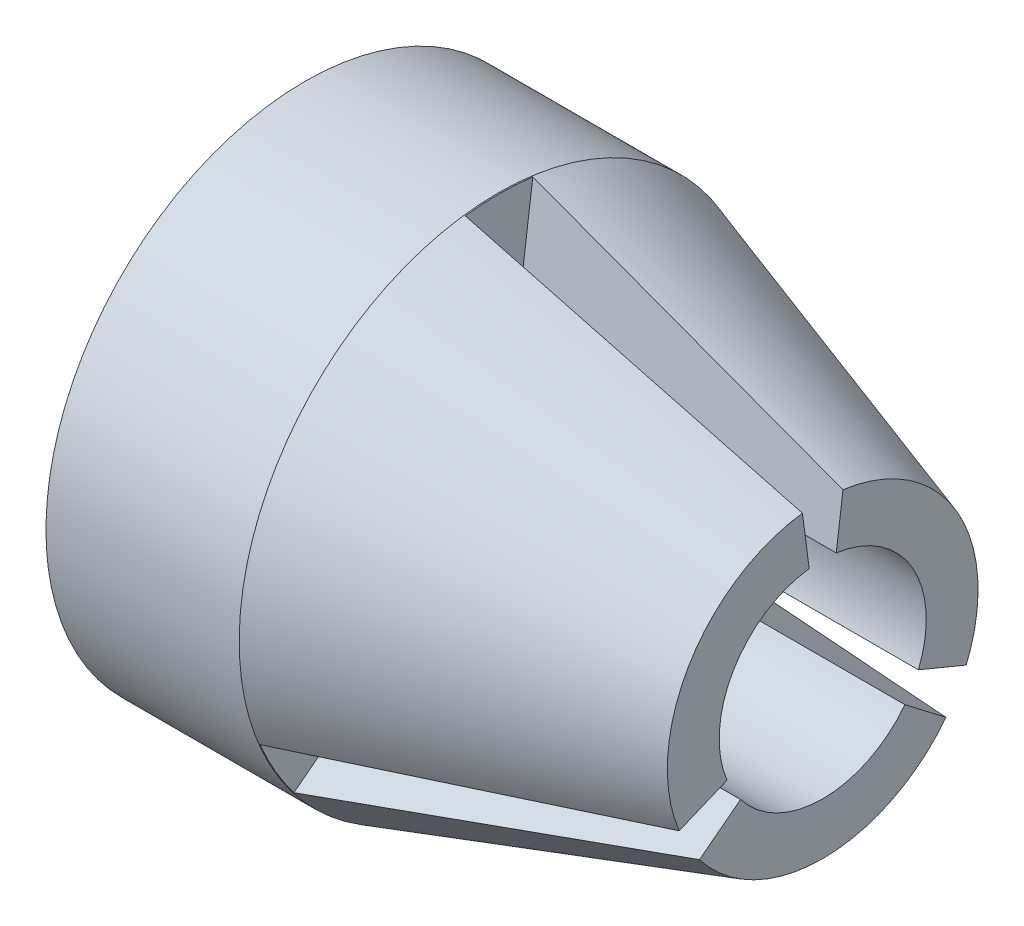
ISO-10303-21;
HEADER;
FILE_DESCRIPTION(('STEP AP214'),'2;1');
FILE_NAME('part.step','',(''),(''),'','','');
FILE_SCHEMA(('AUTOMOTIVE_DESIGN { 1 0 10303 214 1 1 1 1 }'));
ENDSEC;
DATA;
#1=APPLICATION_CONTEXT('core data for automotive mechanical design processes');
#2=APPLICATION_PROTOCOL_DEFINITION('international standard','automotive_design',2000,#1);
#3=PRODUCT_CONTEXT('',#1,'mechanical');
#4=PRODUCT('Part','Part','',(#3));
#5=PRODUCT_RELATED_PRODUCT_CATEGORY('part','',(#4));
#6=PRODUCT_DEFINITION_FORMATION('','',#4);
#7=PRODUCT_DEFINITION_CONTEXT('part definition',#1,'design');
#8=PRODUCT_DEFINITION('design','',#6,#7);
#9=PRODUCT_DEFINITION_SHAPE('','',#8);
#10=(LENGTH_UNIT() NAMED_UNIT(*) SI_UNIT(.MILLI.,.METRE.));
#11=(NAMED_UNIT(*) PLANE_ANGLE_UNIT() SI_UNIT($,.RADIAN.));
#12=(NAMED_UNIT(*) SI_UNIT($,.STERADIAN.) SOLID_ANGLE_UNIT());
#13=UNCERTAINTY_MEASURE_WITH_UNIT(LENGTH_MEASURE(1.E-05),#10,'distance_accuracy_value','');
#14=(GEOMETRIC_REPRESENTATION_CONTEXT(3) GLOBAL_UNCERTAINTY_ASSIGNED_CONTEXT((#13)) GLOBAL_UNIT_ASSIGNED_CONTEXT((#10,
#11,#12)) REPRESENTATION_CONTEXT('',''));
#15=CARTESIAN_POINT('',(0.,0.,0.));
#16=DIRECTION('',(0.,0.,1.));
#17=DIRECTION('',(1.,0.,0.));
#18=AXIS2_PLACEMENT_3D('',#15,#16,#17);
#19=CARTESIAN_POINT('',(10.,0.,0.));
#20=DIRECTION('',(-1.,0.,0.));
#21=DIRECTION('',(0.,-1.,0.));
#22=AXIS2_PLACEMENT_3D('',#19,#20,#21);
#23=CONICAL_SURFACE('',#22,3.,0.308847797397002);
#24=CARTESIAN_POINT('',(3.7315382726071,0.,0.));
#25=DIRECTION('',(1.,0.,0.));
#26=DIRECTION('',(0.,1.,0.));
#27=AXIS2_PLACEMENT_3D('',#24,#25,#26);
#28=CIRCLE('',#27,5.);
#29=CARTESIAN_POINT('',(3.7315382726071,5.,0.));
#30=VERTEX_POINT('',#29);
#31=EDGE_CURVE('E381',#30,#30,#28,.T.);
#32=ORIENTED_EDGE('',*,*,#31,.T.);
#33=EDGE_LOOP('',(#32));
#34=FACE_BOUND('',#33,.T.);
#35=CARTESIAN_POINT('',(10.,0.,0.));
#36=DIRECTION('',(1.,0.,0.));
#37=DIRECTION('',(0.,1.,0.));
#38=AXIS2_PLACEMENT_3D('',#35,#36,#37);
#39=CIRCLE('',#38,3.);
#40=CARTESIAN_POINT('',(10.,2.97433458412143,0.391578576660156));
#41=VERTEX_POINT('',#40);
#42=CARTESIAN_POINT('',(10.,-1.14805029709524,2.77163859753387));
#43=VERTEX_POINT('',#42);
#44=EDGE_CURVE('E262',#41,#43,#39,.T.);
#45=ORIENTED_EDGE('',*,*,#44,.F.);
#46=DIRECTION('',(0.952684427017851,-0.301360723173959,-0.0396748918805956));
#47=VECTOR('',#46,1.);
#48=CARTESIAN_POINT('',(19.4026925910893,0.,0.));
#49=LINE('',#48,#47);
#50=CARTESIAN_POINT('',(3.75,4.9513843462689,0.651862115701439));
#51=VERTEX_POINT('',#50);
#52=EDGE_CURVE('E427',#41,#51,#49,.F.);
#53=ORIENTED_EDGE('',*,*,#52,.T.);
#54=CARTESIAN_POINT('',(3.75,0.,0.));
#55=DIRECTION('',(1.,0.,0.));
#56=DIRECTION('',(0.,1.,0.));
#57=AXIS2_PLACEMENT_3D('',#54,#55,#56);
#58=CIRCLE('',#57,4.99410964661004);
#59=CARTESIAN_POINT('',(3.75,4.9513843462689,-0.651862115701437));
#60=VERTEX_POINT('',#59);
#61=EDGE_CURVE('E420',#51,#60,#58,.F.);
#62=ORIENTED_EDGE('',*,*,#61,.T.);
#63=DIRECTION('',(0.952684427017851,-0.301360723173959,0.0396748918805955));
#64=VECTOR('',#63,1.);
#65=CARTESIAN_POINT('',(19.4026925910893,0.,0.));
#66=LINE('',#65,#64);
#67=CARTESIAN_POINT('',(10.,2.97433458412143,-0.391578576660156));
#68=VERTEX_POINT('',#67);
#69=EDGE_CURVE('E448',#68,#60,#66,.F.);
#70=ORIENTED_EDGE('',*,*,#69,.F.);
#71=CARTESIAN_POINT('',(10.,-1.14805029709528,-2.77163859753386));
#72=VERTEX_POINT('',#71);
#73=EDGE_CURVE('E207',#72,#68,#39,.T.);
#74=ORIENTED_EDGE('',*,*,#73,.F.);
#75=DIRECTION('',(0.952684427017852,0.116320897325984,0.280823487911795));
#76=VECTOR('',#75,1.);
#77=CARTESIAN_POINT('',(19.4026925910893,0.,0.));
#78=LINE('',#77,#76);
#79=CARTESIAN_POINT('',(3.75,-1.91116302117235,-4.61395568562018));
#80=VERTEX_POINT('',#79);
#81=EDGE_CURVE('E253',#72,#80,#78,.F.);
#82=ORIENTED_EDGE('',*,*,#81,.T.);
#83=CARTESIAN_POINT('',(3.75,0.,0.));
#84=DIRECTION('',(1.,0.,0.));
#85=DIRECTION('',(0.,1.,0.));
#86=AXIS2_PLACEMENT_3D('',#83,#84,#85);
#87=CIRCLE('',#86,4.99410964661004);
#88=CARTESIAN_POINT('',(3.75,-3.04022132509658,-3.96209356991874));
#89=VERTEX_POINT('',#88);
#90=EDGE_CURVE('E315',#80,#89,#87,.F.);
#91=ORIENTED_EDGE('',*,*,#90,.T.);
#92=DIRECTION('',(0.952684427017852,0.185039825847977,0.241148596031199));
#93=VECTOR('',#92,1.);
#94=CARTESIAN_POINT('',(19.4026925910893,0.,0.));
#95=LINE('',#94,#93);
#96=CARTESIAN_POINT('',(10.,-1.82628428702618,-2.3800600208737));
#97=VERTEX_POINT('',#96);
#98=EDGE_CURVE('E331',#97,#89,#95,.F.);
#99=ORIENTED_EDGE('',*,*,#98,.F.);
#100=CARTESIAN_POINT('',(10.,-1.82628428702614,2.38006002087372));
#101=VERTEX_POINT('',#100);
#102=EDGE_CURVE('E259',#101,#97,#39,.T.);
#103=ORIENTED_EDGE('',*,*,#102,.F.);
#104=DIRECTION('',(0.952684427017851,0.185039825847974,-0.241148596031202));
#105=VECTOR('',#104,1.);
#106=CARTESIAN_POINT('',(19.4026925910893,0.,0.));
#107=LINE('',#106,#105);
#108=CARTESIAN_POINT('',(3.75,-3.04022132509653,3.96209356991878));
#109=VERTEX_POINT('',#108);
#110=EDGE_CURVE('E301',#101,#109,#107,.F.);
#111=ORIENTED_EDGE('',*,*,#110,.T.);
#112=CARTESIAN_POINT('',(3.75,0.,0.));
#113=DIRECTION('',(-1.,0.,0.));
#114=DIRECTION('',(0.,-1.,0.));
#115=AXIS2_PLACEMENT_3D('',#112,#113,#114);
#116=CIRCLE('',#115,4.99410964661004);
#117=CARTESIAN_POINT('',(3.75,-1.91116302117229,4.61395568562021));
#118=VERTEX_POINT('',#117);
#119=EDGE_CURVE('E284',#118,#109,#116,.F.);
#120=ORIENTED_EDGE('',*,*,#119,.F.);
#121=DIRECTION('',(0.952684427017852,0.11632089732598,-0.280823487911797));
#122=VECTOR('',#121,1.);
#123=CARTESIAN_POINT('',(19.4026925910893,0.,0.));
#124=LINE('',#123,#122);
#125=EDGE_CURVE('E289',#43,#118,#124,.F.);
#126=ORIENTED_EDGE('',*,*,#125,.F.);
#127=EDGE_LOOP('',(#45,#53,#62,#70,#74,#82,#91,#99,#103,#111,#120,#126));
#128=FACE_BOUND('',#127,.T.);
#129=ADVANCED_FACE('F63',(#34,#128),#23,.T.);
#130=CARTESIAN_POINT('',(5.,0.,0.));
#131=DIRECTION('',(-1.,0.,0.));
#132=DIRECTION('',(0.,-1.,0.));
#133=AXIS2_PLACEMENT_3D('',#130,#131,#132);
#134=CYLINDRICAL_SURFACE('',#133,1.);
#135=CARTESIAN_POINT('',(0.,0.,0.));
#136=DIRECTION('',(-1.,0.,0.));
#137=DIRECTION('',(0.,-1.,0.));
#138=AXIS2_PLACEMENT_3D('',#135,#136,#137);
#139=CIRCLE('',#138,1.);
#140=CARTESIAN_POINT('',(0.,-1.,0.));
#141=VERTEX_POINT('',#140);
#142=EDGE_CURVE('E246',#141,#141,#139,.T.);
#143=ORIENTED_EDGE('',*,*,#142,.T.);
#144=EDGE_LOOP('',(#143));
#145=FACE_BOUND('',#144,.T.);
#146=DIRECTION('',(-1.,0.,0.));
#147=VECTOR('',#146,1.);
#148=CARTESIAN_POINT('',(5.,0.99144486137381,0.130526192220052));
#149=LINE('',#148,#147);
#150=CARTESIAN_POINT('',(5.,0.99144486137381,0.130526192220052));
#151=VERTEX_POINT('',#150);
#152=CARTESIAN_POINT('',(3.75,0.99144486137381,0.130526192220052));
#153=VERTEX_POINT('',#152);
#154=EDGE_CURVE('E442',#151,#153,#149,.T.);
#155=ORIENTED_EDGE('',*,*,#154,.F.);
#156=CARTESIAN_POINT('',(5.,0.,0.));
#157=DIRECTION('',(-1.,0.,0.));
#158=DIRECTION('',(0.,-1.,0.));
#159=AXIS2_PLACEMENT_3D('',#156,#157,#158);
#160=CIRCLE('',#159,1.);
#161=CARTESIAN_POINT('',(5.,-0.382683432365082,0.92387953251129));
#162=VERTEX_POINT('',#161);
#163=EDGE_CURVE('E234',#162,#151,#160,.T.);
#164=ORIENTED_EDGE('',*,*,#163,.F.);
#165=DIRECTION('',(-1.,0.,0.));
#166=VECTOR('',#165,1.);
#167=CARTESIAN_POINT('',(5.,-0.382683432365082,0.92387953251129));
#168=LINE('',#167,#166);
#169=CARTESIAN_POINT('',(3.75,-0.382683432365082,0.92387953251129));
#170=VERTEX_POINT('',#169);
#171=EDGE_CURVE('E282',#162,#170,#168,.T.);
#172=ORIENTED_EDGE('',*,*,#171,.T.);
#173=CARTESIAN_POINT('',(3.75,0.,0.));
#174=DIRECTION('',(-1.,0.,0.));
#175=DIRECTION('',(0.,-1.,0.));
#176=AXIS2_PLACEMENT_3D('',#173,#174,#175);
#177=CIRCLE('',#176,1.);
#178=CARTESIAN_POINT('',(3.75,-0.608761429008714,0.79335334029124));
#179=VERTEX_POINT('',#178);
#180=EDGE_CURVE('E398',#170,#179,#177,.F.);
#181=ORIENTED_EDGE('',*,*,#180,.T.);
#182=DIRECTION('',(-1.,0.,0.));
#183=VECTOR('',#182,1.);
#184=CARTESIAN_POINT('',(5.,-0.608761429008715,0.79335334029124));
#185=LINE('',#184,#183);
#186=CARTESIAN_POINT('',(5.,-0.608761429008715,0.79335334029124));
#187=VERTEX_POINT('',#186);
#188=EDGE_CURVE('E404',#187,#179,#185,.T.);
#189=ORIENTED_EDGE('',*,*,#188,.F.);
#190=CARTESIAN_POINT('',(5.,-0.608761429008725,-0.793353340291232));
#191=VERTEX_POINT('',#190);
#192=EDGE_CURVE('E226',#191,#187,#160,.T.);
#193=ORIENTED_EDGE('',*,*,#192,.F.);
#194=DIRECTION('',(-1.,0.,0.));
#195=VECTOR('',#194,1.);
#196=CARTESIAN_POINT('',(5.,-0.608761429008725,-0.793353340291232));
#197=LINE('',#196,#195);
#198=CARTESIAN_POINT('',(3.75,-0.608761429008725,-0.793353340291232));
#199=VERTEX_POINT('',#198);
#200=EDGE_CURVE('E391',#191,#199,#197,.T.);
#201=ORIENTED_EDGE('',*,*,#200,.T.);
#202=CARTESIAN_POINT('',(3.75,0.,0.));
#203=DIRECTION('',(1.,0.,0.));
#204=DIRECTION('',(0.,1.,0.));
#205=AXIS2_PLACEMENT_3D('',#202,#203,#204);
#206=CIRCLE('',#205,1.);
#207=CARTESIAN_POINT('',(3.75,-0.382683432365094,-0.923879532511285));
#208=VERTEX_POINT('',#207);
#209=EDGE_CURVE('E386',#208,#199,#206,.F.);
#210=ORIENTED_EDGE('',*,*,#209,.F.);
#211=DIRECTION('',(-1.,0.,0.));
#212=VECTOR('',#211,1.);
#213=CARTESIAN_POINT('',(5.,-0.382683432365094,-0.923879532511285));
#214=LINE('',#213,#212);
#215=CARTESIAN_POINT('',(5.,-0.382683432365094,-0.923879532511285));
#216=VERTEX_POINT('',#215);
#217=EDGE_CURVE('E395',#216,#208,#214,.T.);
#218=ORIENTED_EDGE('',*,*,#217,.F.);
#219=CARTESIAN_POINT('',(5.,0.99144486137381,-0.130526192220052));
#220=VERTEX_POINT('',#219);
#221=EDGE_CURVE('E236',#220,#216,#160,.T.);
#222=ORIENTED_EDGE('',*,*,#221,.F.);
#223=DIRECTION('',(-1.,0.,0.));
#224=VECTOR('',#223,1.);
#225=CARTESIAN_POINT('',(5.,0.99144486137381,-0.130526192220052));
#226=LINE('',#225,#224);
#227=CARTESIAN_POINT('',(3.75,0.99144486137381,-0.130526192220052));
#228=VERTEX_POINT('',#227);
#229=EDGE_CURVE('E79',#220,#228,#226,.T.);
#230=ORIENTED_EDGE('',*,*,#229,.T.);
#231=CARTESIAN_POINT('',(3.75,0.,0.));
#232=DIRECTION('',(1.,0.,0.));
#233=DIRECTION('',(0.,1.,0.));
#234=AXIS2_PLACEMENT_3D('',#231,#232,#233);
#235=CIRCLE('',#234,1.);
#236=EDGE_CURVE('E12',#153,#228,#235,.F.);
#237=ORIENTED_EDGE('',*,*,#236,.F.);
#238=EDGE_LOOP('',(#155,#164,#172,#181,#189,#193,#201,#210,#218,#222,#230,#237));
#239=FACE_BOUND('',#238,.T.);
#240=ADVANCED_FACE('F359',(#145,#239),#134,.F.);
#241=CARTESIAN_POINT('',(10.,3.,0.));
#242=DIRECTION('',(1.,0.,0.));
#243=DIRECTION('',(0.,1.,0.));
#244=AXIS2_PLACEMENT_3D('',#241,#242,#243);
#245=PLANE('',#244);
#246=CARTESIAN_POINT('',(10.,0.,0.));
#247=DIRECTION('',(1.,0.,0.));
#248=DIRECTION('',(0.,1.,0.));
#249=AXIS2_PLACEMENT_3D('',#246,#247,#248);
#250=CIRCLE('',#249,2.);
#251=CARTESIAN_POINT('',(10.,1.98288972274762,0.261052384440104));
#252=VERTEX_POINT('',#251);
#253=CARTESIAN_POINT('',(10.,-0.765366864730163,1.84775906502258));
#254=VERTEX_POINT('',#253);
#255=EDGE_CURVE('E216',#252,#254,#250,.T.);
#256=ORIENTED_EDGE('',*,*,#255,.F.);
#257=DIRECTION('',(0.,0.99144486137381,0.130526192220052));
#258=VECTOR('',#257,1.);
#259=CARTESIAN_POINT('',(10.,0.,0.));
#260=LINE('',#259,#258);
#261=EDGE_CURVE('E198',#252,#41,#260,.T.);
#262=ORIENTED_EDGE('',*,*,#261,.T.);
#263=ORIENTED_EDGE('',*,*,#44,.T.);
#264=DIRECTION('',(0.,-0.382683432365081,0.92387953251129));
#265=VECTOR('',#264,1.);
#266=CARTESIAN_POINT('',(10.,0.,0.));
#267=LINE('',#266,#265);
#268=EDGE_CURVE('E424',#254,#43,#267,.T.);
#269=ORIENTED_EDGE('',*,*,#268,.F.);
#270=EDGE_LOOP('',(#256,#262,#263,#269));
#271=FACE_BOUND('',#270,.T.);
#272=ADVANCED_FACE('F365',(#271),#245,.T.);
#273=CARTESIAN_POINT('',(5.,0.,0.));
#274=DIRECTION('',(1.,0.,0.));
#275=DIRECTION('',(0.,1.,0.));
#276=AXIS2_PLACEMENT_3D('',#273,#274,#275);
#277=CYLINDRICAL_SURFACE('',#276,2.);
#278=DIRECTION('',(1.,0.,0.));
#279=VECTOR('',#278,1.);
#280=CARTESIAN_POINT('',(5.,1.98288972274762,0.261052384440104));
#281=LINE('',#280,#279);
#282=CARTESIAN_POINT('',(5.,1.98288972274762,0.261052384440104));
#283=VERTEX_POINT('',#282);
#284=EDGE_CURVE('E445',#252,#283,#281,.F.);
#285=ORIENTED_EDGE('',*,*,#284,.F.);
#286=ORIENTED_EDGE('',*,*,#255,.T.);
#287=DIRECTION('',(1.,0.,0.));
#288=VECTOR('',#287,1.);
#289=CARTESIAN_POINT('',(5.,-0.765366864730163,1.84775906502258));
#290=LINE('',#289,#288);
#291=CARTESIAN_POINT('',(5.,-0.765366864730163,1.84775906502258));
#292=VERTEX_POINT('',#291);
#293=EDGE_CURVE('E278',#254,#292,#290,.F.);
#294=ORIENTED_EDGE('',*,*,#293,.T.);
#295=CARTESIAN_POINT('',(5.,0.,0.));
#296=DIRECTION('',(1.,0.,0.));
#297=DIRECTION('',(0.,1.,0.));
#298=AXIS2_PLACEMENT_3D('',#295,#296,#297);
#299=CIRCLE('',#298,2.);
#300=EDGE_CURVE('E221',#283,#292,#299,.T.);
#301=ORIENTED_EDGE('',*,*,#300,.F.);
#302=EDGE_LOOP('',(#285,#286,#294,#301));
#303=FACE_BOUND('',#302,.T.);
#304=ADVANCED_FACE('F286',(#303),#277,.F.);
#305=CARTESIAN_POINT('',(5.,0.,0.));
#306=DIRECTION('',(1.,0.,0.));
#307=DIRECTION('',(0.,1.,0.));
#308=AXIS2_PLACEMENT_3D('',#305,#306,#307);
#309=PLANE('',#308);
#310=ORIENTED_EDGE('',*,*,#163,.T.);
#311=DIRECTION('',(0.,0.99144486137381,0.130526192220052));
#312=VECTOR('',#311,1.);
#313=CARTESIAN_POINT('',(5.,0.,0.));
#314=LINE('',#313,#312);
#315=EDGE_CURVE('E72',#151,#283,#314,.T.);
#316=ORIENTED_EDGE('',*,*,#315,.T.);
#317=ORIENTED_EDGE('',*,*,#300,.T.);
#318=DIRECTION('',(0.,-0.382683432365081,0.92387953251129));
#319=VECTOR('',#318,1.);
#320=CARTESIAN_POINT('',(5.,0.,0.));
#321=LINE('',#320,#319);
#322=EDGE_CURVE('E269',#162,#292,#321,.T.);
#323=ORIENTED_EDGE('',*,*,#322,.F.);
#324=EDGE_LOOP('',(#310,#316,#317,#323));
#325=FACE_BOUND('',#324,.T.);
#326=ADVANCED_FACE('F268',(#325),#309,.T.);
#327=CARTESIAN_POINT('',(10.,-1.21752285801743,1.58670668058248));
#328=VERTEX_POINT('',#327);
#329=CARTESIAN_POINT('',(10.,-1.21752285801745,-1.58670668058246));
#330=VERTEX_POINT('',#329);
#331=EDGE_CURVE('E218',#328,#330,#250,.T.);
#332=ORIENTED_EDGE('',*,*,#331,.F.);
#333=DIRECTION('',(0.,-0.608761429008714,0.79335334029124));
#334=VECTOR('',#333,1.);
#335=CARTESIAN_POINT('',(10.,0.,0.));
#336=LINE('',#335,#334);
#337=EDGE_CURVE('E430',#328,#101,#336,.T.);
#338=ORIENTED_EDGE('',*,*,#337,.T.);
#339=ORIENTED_EDGE('',*,*,#102,.T.);
#340=DIRECTION('',(0.,-0.608761429008725,-0.793353340291232));
#341=VECTOR('',#340,1.);
#342=CARTESIAN_POINT('',(10.,0.,0.));
#343=LINE('',#342,#341);
#344=EDGE_CURVE('E311',#330,#97,#343,.T.);
#345=ORIENTED_EDGE('',*,*,#344,.F.);
#346=EDGE_LOOP('',(#332,#338,#339,#345));
#347=FACE_BOUND('',#346,.T.);
#348=ADVANCED_FACE('F356',(#347),#245,.T.);
#349=DIRECTION('',(1.,0.,0.));
#350=VECTOR('',#349,1.);
#351=CARTESIAN_POINT('',(5.,-1.21752285801743,1.58670668058248));
#352=LINE('',#351,#350);
#353=CARTESIAN_POINT('',(5.,-1.21752285801743,1.58670668058248));
#354=VERTEX_POINT('',#353);
#355=EDGE_CURVE('E298',#328,#354,#352,.F.);
#356=ORIENTED_EDGE('',*,*,#355,.F.);
#357=ORIENTED_EDGE('',*,*,#331,.T.);
#358=DIRECTION('',(1.,0.,0.));
#359=VECTOR('',#358,1.);
#360=CARTESIAN_POINT('',(5.,-1.21752285801745,-1.58670668058246));
#361=LINE('',#360,#359);
#362=CARTESIAN_POINT('',(5.,-1.21752285801745,-1.58670668058246));
#363=VERTEX_POINT('',#362);
#364=EDGE_CURVE('E328',#330,#363,#361,.F.);
#365=ORIENTED_EDGE('',*,*,#364,.T.);
#366=EDGE_CURVE('E215',#354,#363,#299,.T.);
#367=ORIENTED_EDGE('',*,*,#366,.F.);
#368=EDGE_LOOP('',(#356,#357,#365,#367));
#369=FACE_BOUND('',#368,.T.);
#370=ADVANCED_FACE('F353',(#369),#277,.F.);
#371=ORIENTED_EDGE('',*,*,#192,.T.);
#372=DIRECTION('',(0.,-0.608761429008714,0.79335334029124));
#373=VECTOR('',#372,1.);
#374=CARTESIAN_POINT('',(5.,0.,0.));
#375=LINE('',#374,#373);
#376=EDGE_CURVE('E292',#187,#354,#375,.T.);
#377=ORIENTED_EDGE('',*,*,#376,.T.);
#378=ORIENTED_EDGE('',*,*,#366,.T.);
#379=DIRECTION('',(0.,-0.608761429008725,-0.793353340291232));
#380=VECTOR('',#379,1.);
#381=CARTESIAN_POINT('',(5.,0.,0.));
#382=LINE('',#381,#380);
#383=EDGE_CURVE('E324',#191,#363,#382,.T.);
#384=ORIENTED_EDGE('',*,*,#383,.F.);
#385=EDGE_LOOP('',(#371,#377,#378,#384));
#386=FACE_BOUND('',#385,.T.);
#387=ADVANCED_FACE('F345',(#386),#309,.T.);
#388=DIRECTION('',(0.,0.99144486137381,-0.130526192220052));
#389=VECTOR('',#388,1.);
#390=CARTESIAN_POINT('',(10.,0.,0.));
#391=LINE('',#390,#389);
#392=CARTESIAN_POINT('',(10.,1.98288972274762,-0.261052384440104));
#393=VERTEX_POINT('',#392);
#394=EDGE_CURVE('E190',#393,#68,#391,.T.);
#395=ORIENTED_EDGE('',*,*,#394,.F.);
#396=CARTESIAN_POINT('',(10.,-0.765366864730188,-1.84775906502257));
#397=VERTEX_POINT('',#396);
#398=EDGE_CURVE('E205',#397,#393,#250,.T.);
#399=ORIENTED_EDGE('',*,*,#398,.F.);
#400=DIRECTION('',(0.,-0.382683432365094,-0.923879532511285));
#401=VECTOR('',#400,1.);
#402=CARTESIAN_POINT('',(10.,0.,0.));
#403=LINE('',#402,#401);
#404=EDGE_CURVE('E305',#397,#72,#403,.T.);
#405=ORIENTED_EDGE('',*,*,#404,.T.);
#406=ORIENTED_EDGE('',*,*,#73,.T.);
#407=EDGE_LOOP('',(#395,#399,#405,#406));
#408=FACE_BOUND('',#407,.T.);
#409=ADVANCED_FACE('F203',(#408),#245,.T.);
#410=ORIENTED_EDGE('',*,*,#398,.T.);
#411=DIRECTION('',(1.,0.,0.));
#412=VECTOR('',#411,1.);
#413=CARTESIAN_POINT('',(5.,1.98288972274762,-0.261052384440104));
#414=LINE('',#413,#412);
#415=CARTESIAN_POINT('',(5.,1.98288972274762,-0.261052384440104));
#416=VERTEX_POINT('',#415);
#417=EDGE_CURVE('E187',#393,#416,#414,.F.);
#418=ORIENTED_EDGE('',*,*,#417,.T.);
#419=CARTESIAN_POINT('',(5.,-0.765366864730188,-1.84775906502257));
#420=VERTEX_POINT('',#419);
#421=EDGE_CURVE('E223',#420,#416,#299,.T.);
#422=ORIENTED_EDGE('',*,*,#421,.F.);
#423=DIRECTION('',(1.,0.,0.));
#424=VECTOR('',#423,1.);
#425=CARTESIAN_POINT('',(5.,-0.765366864730188,-1.84775906502257));
#426=LINE('',#425,#424);
#427=EDGE_CURVE('E213',#397,#420,#426,.F.);
#428=ORIENTED_EDGE('',*,*,#427,.F.);
#429=EDGE_LOOP('',(#410,#418,#422,#428));
#430=FACE_BOUND('',#429,.T.);
#431=ADVANCED_FACE('F212',(#430),#277,.F.);
#432=DIRECTION('',(0.,0.99144486137381,-0.130526192220052));
#433=VECTOR('',#432,1.);
#434=CARTESIAN_POINT('',(5.,0.,0.));
#435=LINE('',#434,#433);
#436=EDGE_CURVE('E192',#220,#416,#435,.T.);
#437=ORIENTED_EDGE('',*,*,#436,.F.);
#438=ORIENTED_EDGE('',*,*,#221,.T.);
#439=DIRECTION('',(0.,-0.382683432365094,-0.923879532511285));
#440=VECTOR('',#439,1.);
#441=CARTESIAN_POINT('',(5.,0.,0.));
#442=LINE('',#441,#440);
#443=EDGE_CURVE('E334',#216,#420,#442,.T.);
#444=ORIENTED_EDGE('',*,*,#443,.T.);
#445=ORIENTED_EDGE('',*,*,#421,.T.);
#446=EDGE_LOOP('',(#437,#438,#444,#445));
#447=FACE_BOUND('',#446,.T.);
#448=ADVANCED_FACE('F342',(#447),#309,.T.);
#449=CARTESIAN_POINT('',(0.,0.,0.));
#450=DIRECTION('',(-1.,0.,0.));
#451=DIRECTION('',(0.,-1.,0.));
#452=AXIS2_PLACEMENT_3D('',#449,#450,#451);
#453=PLANE('',#452);
#454=ORIENTED_EDGE('',*,*,#142,.F.);
#455=EDGE_LOOP('',(#454));
#456=FACE_BOUND('',#455,.T.);
#457=CARTESIAN_POINT('',(0.,0.,0.));
#458=DIRECTION('',(1.,0.,0.));
#459=DIRECTION('',(0.,1.,0.));
#460=AXIS2_PLACEMENT_3D('',#457,#458,#459);
#461=CIRCLE('',#460,5.);
#462=CARTESIAN_POINT('',(0.,5.,0.));
#463=VERTEX_POINT('',#462);
#464=EDGE_CURVE('E379',#463,#463,#461,.T.);
#465=ORIENTED_EDGE('',*,*,#464,.F.);
#466=EDGE_LOOP('',(#465));
#467=FACE_BOUND('',#466,.T.);
#468=ADVANCED_FACE('F65',(#456,#467),#453,.T.);
#469=CARTESIAN_POINT('',(10.,0.,0.));
#470=DIRECTION('',(1.,0.,0.));
#471=DIRECTION('',(0.,1.,0.));
#472=AXIS2_PLACEMENT_3D('',#469,#470,#471);
#473=CYLINDRICAL_SURFACE('',#472,5.);
#474=ORIENTED_EDGE('',*,*,#464,.T.);
#475=EDGE_LOOP('',(#474));
#476=FACE_BOUND('',#475,.T.);
#477=ORIENTED_EDGE('',*,*,#31,.F.);
#478=EDGE_LOOP('',(#477));
#479=FACE_BOUND('',#478,.T.);
#480=ADVANCED_FACE('F350',(#476,#479),#473,.T.);
#481=CARTESIAN_POINT('',(3.75,0.,0.));
#482=DIRECTION('',(0.,-0.923879532511285,0.382683432365094));
#483=DIRECTION('',(0.,-0.382683432365094,-0.923879532511285));
#484=AXIS2_PLACEMENT_3D('',#481,#482,#483);
#485=PLANE('',#484);
#486=ORIENTED_EDGE('',*,*,#404,.F.);
#487=ORIENTED_EDGE('',*,*,#427,.T.);
#488=ORIENTED_EDGE('',*,*,#443,.F.);
#489=ORIENTED_EDGE('',*,*,#217,.T.);
#490=DIRECTION('',(0.,-0.382683432365094,-0.923879532511285));
#491=VECTOR('',#490,1.);
#492=CARTESIAN_POINT('',(3.75,0.,0.));
#493=LINE('',#492,#491);
#494=EDGE_CURVE('E306',#208,#80,#493,.T.);
#495=ORIENTED_EDGE('',*,*,#494,.T.);
#496=ORIENTED_EDGE('',*,*,#81,.F.);
#497=EDGE_LOOP('',(#486,#487,#488,#489,#495,#496));
#498=FACE_BOUND('',#497,.T.);
#499=ADVANCED_FACE('F339',(#498),#485,.T.);
#500=CARTESIAN_POINT('',(3.75,0.,0.));
#501=DIRECTION('',(0.,-0.793353340291232,0.608761429008725));
#502=DIRECTION('',(0.,-0.608761429008725,-0.793353340291232));
#503=AXIS2_PLACEMENT_3D('',#500,#501,#502);
#504=PLANE('',#503);
#505=ORIENTED_EDGE('',*,*,#98,.T.);
#506=DIRECTION('',(0.,-0.608761429008725,-0.793353340291232));
#507=VECTOR('',#506,1.);
#508=CARTESIAN_POINT('',(3.75,0.,0.));
#509=LINE('',#508,#507);
#510=EDGE_CURVE('E310',#199,#89,#509,.T.);
#511=ORIENTED_EDGE('',*,*,#510,.F.);
#512=ORIENTED_EDGE('',*,*,#200,.F.);
#513=ORIENTED_EDGE('',*,*,#383,.T.);
#514=ORIENTED_EDGE('',*,*,#364,.F.);
#515=ORIENTED_EDGE('',*,*,#344,.T.);
#516=EDGE_LOOP('',(#505,#511,#512,#513,#514,#515));
#517=FACE_BOUND('',#516,.T.);
#518=ADVANCED_FACE('F374',(#517),#504,.F.);
#519=CARTESIAN_POINT('',(3.75,0.,0.));
#520=DIRECTION('',(1.,0.,0.));
#521=DIRECTION('',(0.,1.,0.));
#522=AXIS2_PLACEMENT_3D('',#519,#520,#521);
#523=PLANE('',#522);
#524=ORIENTED_EDGE('',*,*,#494,.F.);
#525=ORIENTED_EDGE('',*,*,#209,.T.);
#526=ORIENTED_EDGE('',*,*,#510,.T.);
#527=ORIENTED_EDGE('',*,*,#90,.F.);
#528=EDGE_LOOP('',(#524,#525,#526,#527));
#529=FACE_BOUND('',#528,.T.);
#530=ADVANCED_FACE('F472',(#529),#523,.T.);
#531=CARTESIAN_POINT('',(3.75,0.,0.));
#532=DIRECTION('',(0.,0.79335334029124,0.608761429008714));
#533=DIRECTION('',(0.,-0.608761429008714,0.79335334029124));
#534=AXIS2_PLACEMENT_3D('',#531,#532,#533);
#535=PLANE('',#534);
#536=ORIENTED_EDGE('',*,*,#337,.F.);
#537=ORIENTED_EDGE('',*,*,#355,.T.);
#538=ORIENTED_EDGE('',*,*,#376,.F.);
#539=ORIENTED_EDGE('',*,*,#188,.T.);
#540=DIRECTION('',(0.,-0.608761429008714,0.79335334029124));
#541=VECTOR('',#540,1.);
#542=CARTESIAN_POINT('',(3.75,0.,0.));
#543=LINE('',#542,#541);
#544=EDGE_CURVE('E87',#179,#109,#543,.T.);
#545=ORIENTED_EDGE('',*,*,#544,.T.);
#546=ORIENTED_EDGE('',*,*,#110,.F.);
#547=EDGE_LOOP('',(#536,#537,#538,#539,#545,#546));
#548=FACE_BOUND('',#547,.T.);
#549=ADVANCED_FACE('F411',(#548),#535,.T.);
#550=CARTESIAN_POINT('',(3.75,0.,0.));
#551=DIRECTION('',(0.,0.92387953251129,0.382683432365081));
#552=DIRECTION('',(0.,-0.382683432365081,0.92387953251129));
#553=AXIS2_PLACEMENT_3D('',#550,#551,#552);
#554=PLANE('',#553);
#555=ORIENTED_EDGE('',*,*,#125,.T.);
#556=DIRECTION('',(0.,-0.382683432365081,0.92387953251129));
#557=VECTOR('',#556,1.);
#558=CARTESIAN_POINT('',(3.75,0.,0.));
#559=LINE('',#558,#557);
#560=EDGE_CURVE('E416',#170,#118,#559,.T.);
#561=ORIENTED_EDGE('',*,*,#560,.F.);
#562=ORIENTED_EDGE('',*,*,#171,.F.);
#563=ORIENTED_EDGE('',*,*,#322,.T.);
#564=ORIENTED_EDGE('',*,*,#293,.F.);
#565=ORIENTED_EDGE('',*,*,#268,.T.);
#566=EDGE_LOOP('',(#555,#561,#562,#563,#564,#565));
#567=FACE_BOUND('',#566,.T.);
#568=ADVANCED_FACE('F276',(#567),#554,.F.);
#569=CARTESIAN_POINT('',(3.75,0.,0.));
#570=DIRECTION('',(-1.,0.,0.));
#571=DIRECTION('',(0.,-1.,0.));
#572=AXIS2_PLACEMENT_3D('',#569,#570,#571);
#573=PLANE('',#572);
#574=ORIENTED_EDGE('',*,*,#119,.T.);
#575=ORIENTED_EDGE('',*,*,#544,.F.);
#576=ORIENTED_EDGE('',*,*,#180,.F.);
#577=ORIENTED_EDGE('',*,*,#560,.T.);
#578=EDGE_LOOP('',(#574,#575,#576,#577));
#579=FACE_BOUND('',#578,.T.);
#580=ADVANCED_FACE('F415',(#579),#573,.F.);
#581=CARTESIAN_POINT('',(3.75,0.,0.));
#582=DIRECTION('',(1.,0.,0.));
#583=DIRECTION('',(0.,1.,0.));
#584=AXIS2_PLACEMENT_3D('',#581,#582,#583);
#585=PLANE('',#584);
#586=DIRECTION('',(0.,0.99144486137381,0.130526192220052));
#587=VECTOR('',#586,1.);
#588=CARTESIAN_POINT('',(3.75,0.,0.));
#589=LINE('',#588,#587);
#590=EDGE_CURVE('E209',#153,#51,#589,.T.);
#591=ORIENTED_EDGE('',*,*,#590,.F.);
#592=ORIENTED_EDGE('',*,*,#236,.T.);
#593=DIRECTION('',(0.,0.99144486137381,-0.130526192220052));
#594=VECTOR('',#593,1.);
#595=CARTESIAN_POINT('',(3.75,0.,0.));
#596=LINE('',#595,#594);
#597=EDGE_CURVE('E456',#228,#60,#596,.T.);
#598=ORIENTED_EDGE('',*,*,#597,.T.);
#599=ORIENTED_EDGE('',*,*,#61,.F.);
#600=EDGE_LOOP('',(#591,#592,#598,#599));
#601=FACE_BOUND('',#600,.T.);
#602=ADVANCED_FACE('F477',(#601),#585,.T.);
#603=CARTESIAN_POINT('',(3.75,0.,0.));
#604=DIRECTION('',(0.,0.130526192220052,-0.99144486137381));
#605=DIRECTION('',(0.,0.99144486137381,0.130526192220052));
#606=AXIS2_PLACEMENT_3D('',#603,#604,#605);
#607=PLANE('',#606);
#608=ORIENTED_EDGE('',*,*,#261,.F.);
#609=ORIENTED_EDGE('',*,*,#284,.T.);
#610=ORIENTED_EDGE('',*,*,#315,.F.);
#611=ORIENTED_EDGE('',*,*,#154,.T.);
#612=ORIENTED_EDGE('',*,*,#590,.T.);
#613=ORIENTED_EDGE('',*,*,#52,.F.);
#614=EDGE_LOOP('',(#608,#609,#610,#611,#612,#613));
#615=FACE_BOUND('',#614,.T.);
#616=ADVANCED_FACE('F478',(#615),#607,.T.);
#617=CARTESIAN_POINT('',(3.75,0.,0.));
#618=DIRECTION('',(0.,-0.130526192220052,-0.99144486137381));
#619=DIRECTION('',(0.,0.99144486137381,-0.130526192220052));
#620=AXIS2_PLACEMENT_3D('',#617,#618,#619);
#621=PLANE('',#620);
#622=ORIENTED_EDGE('',*,*,#69,.T.);
#623=ORIENTED_EDGE('',*,*,#597,.F.);
#624=ORIENTED_EDGE('',*,*,#229,.F.);
#625=ORIENTED_EDGE('',*,*,#436,.T.);
#626=ORIENTED_EDGE('',*,*,#417,.F.);
#627=ORIENTED_EDGE('',*,*,#394,.T.);
#628=EDGE_LOOP('',(#622,#623,#624,#625,#626,#627));
#629=FACE_BOUND('',#628,.T.);
#630=ADVANCED_FACE('F189',(#629),#621,.F.);
#631=CLOSED_SHELL('',(#129,#240,#272,#304,#326,#348,#370,#387,#409,#431,#448,#468,#480,#499,
#518,#530,#549,#568,#580,#602,#616,#630));
#632=MANIFOLD_SOLID_BREP('B2',#631);
#633=ADVANCED_BREP_SHAPE_REPRESENTATION('',(#18,#632),#14);
#634=SHAPE_DEFINITION_REPRESENTATION(#9,#633);
ENDSEC;
END-ISO-10303-21;
